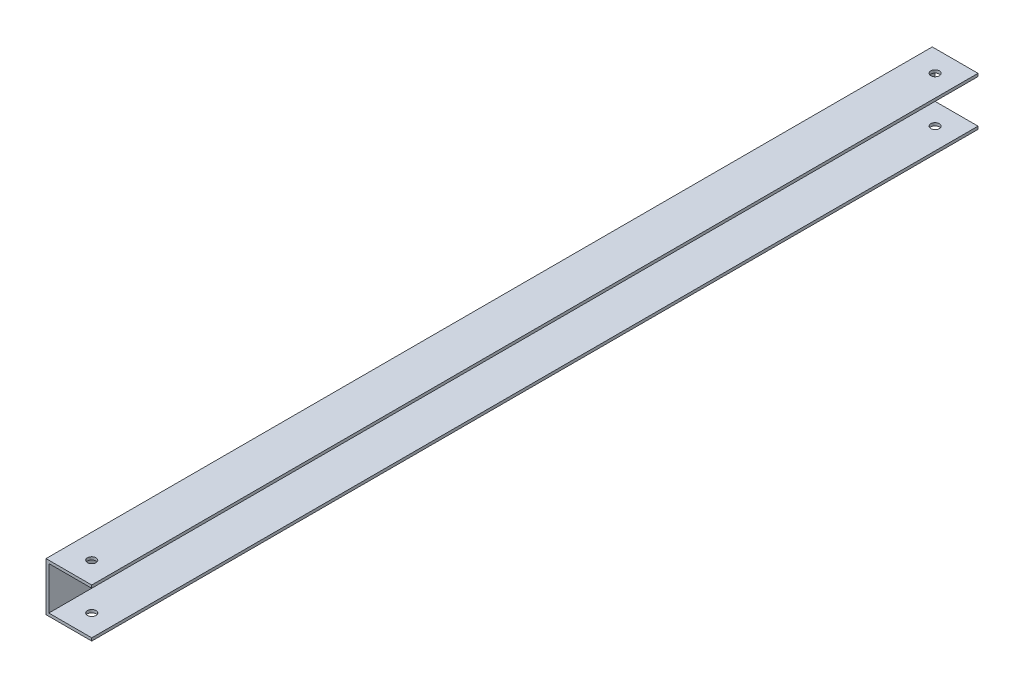
ISO-10303-21;
HEADER;
FILE_DESCRIPTION(('STEP AP214'),'2;1');
FILE_NAME('part.step','',(''),(''),'','','');
FILE_SCHEMA(('AUTOMOTIVE_DESIGN { 1 0 10303 214 1 1 1 1 }'));
ENDSEC;
DATA;
#1=APPLICATION_CONTEXT('core data for automotive mechanical design processes');
#2=APPLICATION_PROTOCOL_DEFINITION('international standard','automotive_design',2000,#1);
#3=PRODUCT_CONTEXT('',#1,'mechanical');
#4=PRODUCT('Part','Part','',(#3));
#5=PRODUCT_RELATED_PRODUCT_CATEGORY('part','',(#4));
#6=PRODUCT_DEFINITION_FORMATION('','',#4);
#7=PRODUCT_DEFINITION_CONTEXT('part definition',#1,'design');
#8=PRODUCT_DEFINITION('design','',#6,#7);
#9=PRODUCT_DEFINITION_SHAPE('','',#8);
#10=(LENGTH_UNIT() NAMED_UNIT(*) SI_UNIT(.MILLI.,.METRE.));
#11=(NAMED_UNIT(*) PLANE_ANGLE_UNIT() SI_UNIT($,.RADIAN.));
#12=(NAMED_UNIT(*) SI_UNIT($,.STERADIAN.) SOLID_ANGLE_UNIT());
#13=UNCERTAINTY_MEASURE_WITH_UNIT(LENGTH_MEASURE(1.E-05),#10,'distance_accuracy_value','');
#14=(GEOMETRIC_REPRESENTATION_CONTEXT(3) GLOBAL_UNCERTAINTY_ASSIGNED_CONTEXT((#13)) GLOBAL_UNIT_ASSIGNED_CONTEXT((#10,
#11,#12)) REPRESENTATION_CONTEXT('',''));
#15=CARTESIAN_POINT('',(0.,0.,0.));
#16=DIRECTION('',(0.,0.,1.));
#17=DIRECTION('',(1.,0.,0.));
#18=AXIS2_PLACEMENT_3D('',#15,#16,#17);
#19=CARTESIAN_POINT('',(-15.,15.,620.));
#20=DIRECTION('',(0.,1.,0.));
#21=DIRECTION('',(0.,0.,1.));
#22=AXIS2_PLACEMENT_3D('',#19,#20,#21);
#23=PLANE('',#22);
#24=CARTESIAN_POINT('',(0.,15.,15.));
#25=DIRECTION('',(0.,1.,0.));
#26=DIRECTION('',(0.,0.,1.));
#27=AXIS2_PLACEMENT_3D('',#24,#25,#26);
#28=CIRCLE('',#27,3.);
#29=CARTESIAN_POINT('',(0.,15.,18.));
#30=VERTEX_POINT('',#29);
#31=EDGE_CURVE('E170',#30,#30,#28,.T.);
#32=ORIENTED_EDGE('',*,*,#31,.T.);
#33=EDGE_LOOP('',(#32));
#34=FACE_BOUND('',#33,.T.);
#35=CARTESIAN_POINT('',(0.,15.,605.));
#36=DIRECTION('',(0.,1.,0.));
#37=DIRECTION('',(0.,0.,1.));
#38=AXIS2_PLACEMENT_3D('',#35,#36,#37);
#39=CIRCLE('',#38,3.);
#40=CARTESIAN_POINT('',(0.,15.,608.));
#41=VERTEX_POINT('',#40);
#42=EDGE_CURVE('E135',#41,#41,#39,.T.);
#43=ORIENTED_EDGE('',*,*,#42,.T.);
#44=EDGE_LOOP('',(#43));
#45=FACE_BOUND('',#44,.T.);
#46=DIRECTION('',(1.,0.,0.));
#47=VECTOR('',#46,1.);
#48=CARTESIAN_POINT('',(-15.,15.,0.));
#49=LINE('',#48,#47);
#50=CARTESIAN_POINT('',(-15.,15.,0.));
#51=VERTEX_POINT('',#50);
#52=CARTESIAN_POINT('',(15.,15.,0.));
#53=VERTEX_POINT('',#52);
#54=EDGE_CURVE('E131',#51,#53,#49,.T.);
#55=ORIENTED_EDGE('',*,*,#54,.T.);
#56=DIRECTION('',(0.,0.,-1.));
#57=VECTOR('',#56,1.);
#58=CARTESIAN_POINT('',(15.,15.,620.));
#59=LINE('',#58,#57);
#60=CARTESIAN_POINT('',(15.,15.,620.));
#61=VERTEX_POINT('',#60);
#62=EDGE_CURVE('E11',#61,#53,#59,.T.);
#63=ORIENTED_EDGE('',*,*,#62,.F.);
#64=DIRECTION('',(1.,0.,0.));
#65=VECTOR('',#64,1.);
#66=CARTESIAN_POINT('',(-15.,15.,620.));
#67=LINE('',#66,#65);
#68=CARTESIAN_POINT('',(-15.,15.,620.));
#69=VERTEX_POINT('',#68);
#70=EDGE_CURVE('E146',#69,#61,#67,.T.);
#71=ORIENTED_EDGE('',*,*,#70,.F.);
#72=DIRECTION('',(0.,0.,-1.));
#73=VECTOR('',#72,1.);
#74=CARTESIAN_POINT('',(-15.,15.,620.));
#75=LINE('',#74,#73);
#76=EDGE_CURVE('E127',#69,#51,#75,.T.);
#77=ORIENTED_EDGE('',*,*,#76,.T.);
#78=EDGE_LOOP('',(#55,#63,#71,#77));
#79=FACE_BOUND('',#78,.T.);
#80=ADVANCED_FACE('F33',(#34,#45,#79),#23,.F.);
#81=CARTESIAN_POINT('',(15.,15.,620.));
#82=DIRECTION('',(-1.,0.,0.));
#83=DIRECTION('',(0.,0.,1.));
#84=AXIS2_PLACEMENT_3D('',#81,#82,#83);
#85=PLANE('',#84);
#86=DIRECTION('',(0.,1.,0.));
#87=VECTOR('',#86,1.);
#88=CARTESIAN_POINT('',(15.,15.,0.));
#89=LINE('',#88,#87);
#90=CARTESIAN_POINT('',(15.,17.,0.));
#91=VERTEX_POINT('',#90);
#92=EDGE_CURVE('E134',#53,#91,#89,.T.);
#93=ORIENTED_EDGE('',*,*,#92,.T.);
#94=DIRECTION('',(0.,0.,-1.));
#95=VECTOR('',#94,1.);
#96=CARTESIAN_POINT('',(15.,17.,620.));
#97=LINE('',#96,#95);
#98=CARTESIAN_POINT('',(15.,17.,620.));
#99=VERTEX_POINT('',#98);
#100=EDGE_CURVE('E42',#99,#91,#97,.T.);
#101=ORIENTED_EDGE('',*,*,#100,.F.);
#102=DIRECTION('',(0.,1.,0.));
#103=VECTOR('',#102,1.);
#104=CARTESIAN_POINT('',(15.,15.,620.));
#105=LINE('',#104,#103);
#106=EDGE_CURVE('E94',#61,#99,#105,.T.);
#107=ORIENTED_EDGE('',*,*,#106,.F.);
#108=ORIENTED_EDGE('',*,*,#62,.T.);
#109=EDGE_LOOP('',(#93,#101,#107,#108));
#110=FACE_BOUND('',#109,.T.);
#111=ADVANCED_FACE('F209',(#110),#85,.F.);
#112=CARTESIAN_POINT('',(-17.,17.,620.));
#113=DIRECTION('',(0.,-1.,0.));
#114=DIRECTION('',(0.,0.,-1.));
#115=AXIS2_PLACEMENT_3D('',#112,#113,#114);
#116=PLANE('',#115);
#117=CARTESIAN_POINT('',(0.,17.,15.));
#118=DIRECTION('',(0.,1.,0.));
#119=DIRECTION('',(0.,0.,1.));
#120=AXIS2_PLACEMENT_3D('',#117,#118,#119);
#121=CIRCLE('',#120,3.);
#122=CARTESIAN_POINT('',(0.,17.,18.));
#123=VERTEX_POINT('',#122);
#124=EDGE_CURVE('E272',#123,#123,#121,.T.);
#125=ORIENTED_EDGE('',*,*,#124,.F.);
#126=EDGE_LOOP('',(#125));
#127=FACE_BOUND('',#126,.T.);
#128=CARTESIAN_POINT('',(0.,17.,605.));
#129=DIRECTION('',(0.,1.,0.));
#130=DIRECTION('',(0.,0.,1.));
#131=AXIS2_PLACEMENT_3D('',#128,#129,#130);
#132=CIRCLE('',#131,3.);
#133=CARTESIAN_POINT('',(0.,17.,608.));
#134=VERTEX_POINT('',#133);
#135=EDGE_CURVE('E165',#134,#134,#132,.T.);
#136=ORIENTED_EDGE('',*,*,#135,.F.);
#137=EDGE_LOOP('',(#136));
#138=FACE_BOUND('',#137,.T.);
#139=DIRECTION('',(-1.,0.,0.));
#140=VECTOR('',#139,1.);
#141=CARTESIAN_POINT('',(-17.,17.,0.));
#142=LINE('',#141,#140);
#143=CARTESIAN_POINT('',(-17.,17.,0.));
#144=VERTEX_POINT('',#143);
#145=EDGE_CURVE('E137',#91,#144,#142,.T.);
#146=ORIENTED_EDGE('',*,*,#145,.T.);
#147=DIRECTION('',(0.,0.,-1.));
#148=VECTOR('',#147,1.);
#149=CARTESIAN_POINT('',(-17.,17.,620.));
#150=LINE('',#149,#148);
#151=CARTESIAN_POINT('',(-17.,17.,620.));
#152=VERTEX_POINT('',#151);
#153=EDGE_CURVE('E153',#152,#144,#150,.T.);
#154=ORIENTED_EDGE('',*,*,#153,.F.);
#155=DIRECTION('',(-1.,0.,0.));
#156=VECTOR('',#155,1.);
#157=CARTESIAN_POINT('',(-17.,17.,620.));
#158=LINE('',#157,#156);
#159=EDGE_CURVE('E177',#99,#152,#158,.T.);
#160=ORIENTED_EDGE('',*,*,#159,.F.);
#161=ORIENTED_EDGE('',*,*,#100,.T.);
#162=EDGE_LOOP('',(#146,#154,#160,#161));
#163=FACE_BOUND('',#162,.T.);
#164=ADVANCED_FACE('F214',(#127,#138,#163),#116,.F.);
#165=CARTESIAN_POINT('',(-17.,-17.,620.));
#166=DIRECTION('',(1.,0.,0.));
#167=DIRECTION('',(0.,0.,-1.));
#168=AXIS2_PLACEMENT_3D('',#165,#166,#167);
#169=PLANE('',#168);
#170=DIRECTION('',(0.,-1.,0.));
#171=VECTOR('',#170,1.);
#172=CARTESIAN_POINT('',(-17.,-17.,0.));
#173=LINE('',#172,#171);
#174=CARTESIAN_POINT('',(-17.,-17.,0.));
#175=VERTEX_POINT('',#174);
#176=EDGE_CURVE('E139',#144,#175,#173,.T.);
#177=ORIENTED_EDGE('',*,*,#176,.T.);
#178=DIRECTION('',(0.,0.,-1.));
#179=VECTOR('',#178,1.);
#180=CARTESIAN_POINT('',(-17.,-17.,620.));
#181=LINE('',#180,#179);
#182=CARTESIAN_POINT('',(-17.,-17.,620.));
#183=VERTEX_POINT('',#182);
#184=EDGE_CURVE('E150',#183,#175,#181,.T.);
#185=ORIENTED_EDGE('',*,*,#184,.F.);
#186=DIRECTION('',(0.,-1.,0.));
#187=VECTOR('',#186,1.);
#188=CARTESIAN_POINT('',(-17.,-17.,620.));
#189=LINE('',#188,#187);
#190=EDGE_CURVE('E179',#152,#183,#189,.T.);
#191=ORIENTED_EDGE('',*,*,#190,.F.);
#192=ORIENTED_EDGE('',*,*,#153,.T.);
#193=EDGE_LOOP('',(#177,#185,#191,#192));
#194=FACE_BOUND('',#193,.T.);
#195=ADVANCED_FACE('F185',(#194),#169,.F.);
#196=CARTESIAN_POINT('',(-17.,-17.,620.));
#197=DIRECTION('',(0.,1.,0.));
#198=DIRECTION('',(0.,0.,1.));
#199=AXIS2_PLACEMENT_3D('',#196,#197,#198);
#200=PLANE('',#199);
#201=CARTESIAN_POINT('',(0.,-17.,15.));
#202=DIRECTION('',(0.,1.,0.));
#203=DIRECTION('',(0.,0.,1.));
#204=AXIS2_PLACEMENT_3D('',#201,#202,#203);
#205=CIRCLE('',#204,3.);
#206=CARTESIAN_POINT('',(0.,-17.,18.));
#207=VERTEX_POINT('',#206);
#208=EDGE_CURVE('E274',#207,#207,#205,.T.);
#209=ORIENTED_EDGE('',*,*,#208,.T.);
#210=EDGE_LOOP('',(#209));
#211=FACE_BOUND('',#210,.T.);
#212=CARTESIAN_POINT('',(0.,-17.,605.));
#213=DIRECTION('',(0.,1.,0.));
#214=DIRECTION('',(0.,0.,1.));
#215=AXIS2_PLACEMENT_3D('',#212,#213,#214);
#216=CIRCLE('',#215,3.);
#217=CARTESIAN_POINT('',(0.,-17.,608.));
#218=VERTEX_POINT('',#217);
#219=EDGE_CURVE('E159',#218,#218,#216,.T.);
#220=ORIENTED_EDGE('',*,*,#219,.T.);
#221=EDGE_LOOP('',(#220));
#222=FACE_BOUND('',#221,.T.);
#223=DIRECTION('',(1.,0.,0.));
#224=VECTOR('',#223,1.);
#225=CARTESIAN_POINT('',(-17.,-17.,0.));
#226=LINE('',#225,#224);
#227=CARTESIAN_POINT('',(15.,-17.,0.));
#228=VERTEX_POINT('',#227);
#229=EDGE_CURVE('E141',#175,#228,#226,.T.);
#230=ORIENTED_EDGE('',*,*,#229,.T.);
#231=DIRECTION('',(0.,0.,-1.));
#232=VECTOR('',#231,1.);
#233=CARTESIAN_POINT('',(15.,-17.,620.));
#234=LINE('',#233,#232);
#235=CARTESIAN_POINT('',(15.,-17.,620.));
#236=VERTEX_POINT('',#235);
#237=EDGE_CURVE('E122',#236,#228,#234,.T.);
#238=ORIENTED_EDGE('',*,*,#237,.F.);
#239=DIRECTION('',(1.,0.,0.));
#240=VECTOR('',#239,1.);
#241=CARTESIAN_POINT('',(-17.,-17.,620.));
#242=LINE('',#241,#240);
#243=EDGE_CURVE('E113',#183,#236,#242,.T.);
#244=ORIENTED_EDGE('',*,*,#243,.F.);
#245=ORIENTED_EDGE('',*,*,#184,.T.);
#246=EDGE_LOOP('',(#230,#238,#244,#245));
#247=FACE_BOUND('',#246,.T.);
#248=ADVANCED_FACE('F189',(#211,#222,#247),#200,.F.);
#249=CARTESIAN_POINT('',(15.,-15.,620.));
#250=DIRECTION('',(-1.,0.,0.));
#251=DIRECTION('',(0.,0.,1.));
#252=AXIS2_PLACEMENT_3D('',#249,#250,#251);
#253=PLANE('',#252);
#254=DIRECTION('',(0.,1.,0.));
#255=VECTOR('',#254,1.);
#256=CARTESIAN_POINT('',(15.,-15.,0.));
#257=LINE('',#256,#255);
#258=CARTESIAN_POINT('',(15.,-15.,0.));
#259=VERTEX_POINT('',#258);
#260=EDGE_CURVE('E121',#228,#259,#257,.T.);
#261=ORIENTED_EDGE('',*,*,#260,.T.);
#262=DIRECTION('',(0.,0.,-1.));
#263=VECTOR('',#262,1.);
#264=CARTESIAN_POINT('',(15.,-15.,620.));
#265=LINE('',#264,#263);
#266=CARTESIAN_POINT('',(15.,-15.,620.));
#267=VERTEX_POINT('',#266);
#268=EDGE_CURVE('E118',#267,#259,#265,.T.);
#269=ORIENTED_EDGE('',*,*,#268,.F.);
#270=DIRECTION('',(0.,1.,0.));
#271=VECTOR('',#270,1.);
#272=CARTESIAN_POINT('',(15.,-15.,620.));
#273=LINE('',#272,#271);
#274=EDGE_CURVE('E107',#236,#267,#273,.T.);
#275=ORIENTED_EDGE('',*,*,#274,.F.);
#276=ORIENTED_EDGE('',*,*,#237,.T.);
#277=EDGE_LOOP('',(#261,#269,#275,#276));
#278=FACE_BOUND('',#277,.T.);
#279=ADVANCED_FACE('F119',(#278),#253,.F.);
#280=CARTESIAN_POINT('',(-15.,-15.,620.));
#281=DIRECTION('',(0.,-1.,0.));
#282=DIRECTION('',(0.,0.,-1.));
#283=AXIS2_PLACEMENT_3D('',#280,#281,#282);
#284=PLANE('',#283);
#285=CARTESIAN_POINT('',(0.,-15.,15.));
#286=DIRECTION('',(0.,-1.,0.));
#287=DIRECTION('',(0.,0.,-1.));
#288=AXIS2_PLACEMENT_3D('',#285,#286,#287);
#289=CIRCLE('',#288,3.);
#290=CARTESIAN_POINT('',(0.,-15.,12.));
#291=VERTEX_POINT('',#290);
#292=EDGE_CURVE('E36',#291,#291,#289,.T.);
#293=ORIENTED_EDGE('',*,*,#292,.T.);
#294=EDGE_LOOP('',(#293));
#295=FACE_BOUND('',#294,.T.);
#296=CARTESIAN_POINT('',(0.,-15.,605.));
#297=DIRECTION('',(0.,-1.,0.));
#298=DIRECTION('',(0.,0.,-1.));
#299=AXIS2_PLACEMENT_3D('',#296,#297,#298);
#300=CIRCLE('',#299,3.);
#301=CARTESIAN_POINT('',(0.,-15.,602.));
#302=VERTEX_POINT('',#301);
#303=EDGE_CURVE('E157',#302,#302,#300,.T.);
#304=ORIENTED_EDGE('',*,*,#303,.T.);
#305=EDGE_LOOP('',(#304));
#306=FACE_BOUND('',#305,.T.);
#307=DIRECTION('',(-1.,0.,0.));
#308=VECTOR('',#307,1.);
#309=CARTESIAN_POINT('',(-15.,-15.,0.));
#310=LINE('',#309,#308);
#311=CARTESIAN_POINT('',(-15.,-15.,0.));
#312=VERTEX_POINT('',#311);
#313=EDGE_CURVE('E80',#259,#312,#310,.T.);
#314=ORIENTED_EDGE('',*,*,#313,.T.);
#315=DIRECTION('',(0.,0.,-1.));
#316=VECTOR('',#315,1.);
#317=CARTESIAN_POINT('',(-15.,-15.,620.));
#318=LINE('',#317,#316);
#319=CARTESIAN_POINT('',(-15.,-15.,620.));
#320=VERTEX_POINT('',#319);
#321=EDGE_CURVE('E123',#320,#312,#318,.T.);
#322=ORIENTED_EDGE('',*,*,#321,.F.);
#323=DIRECTION('',(-1.,0.,0.));
#324=VECTOR('',#323,1.);
#325=CARTESIAN_POINT('',(-15.,-15.,620.));
#326=LINE('',#325,#324);
#327=EDGE_CURVE('E111',#267,#320,#326,.T.);
#328=ORIENTED_EDGE('',*,*,#327,.F.);
#329=ORIENTED_EDGE('',*,*,#268,.T.);
#330=EDGE_LOOP('',(#314,#322,#328,#329));
#331=FACE_BOUND('',#330,.T.);
#332=ADVANCED_FACE('F125',(#295,#306,#331),#284,.F.);
#333=CARTESIAN_POINT('',(-15.,-15.,620.));
#334=DIRECTION('',(-1.,0.,0.));
#335=DIRECTION('',(0.,0.,1.));
#336=AXIS2_PLACEMENT_3D('',#333,#334,#335);
#337=PLANE('',#336);
#338=DIRECTION('',(0.,1.,0.));
#339=VECTOR('',#338,1.);
#340=CARTESIAN_POINT('',(-15.,-15.,0.));
#341=LINE('',#340,#339);
#342=EDGE_CURVE('E86',#312,#51,#341,.T.);
#343=ORIENTED_EDGE('',*,*,#342,.T.);
#344=ORIENTED_EDGE('',*,*,#76,.F.);
#345=DIRECTION('',(0.,1.,0.));
#346=VECTOR('',#345,1.);
#347=CARTESIAN_POINT('',(-15.,-15.,620.));
#348=LINE('',#347,#346);
#349=EDGE_CURVE('E51',#320,#69,#348,.T.);
#350=ORIENTED_EDGE('',*,*,#349,.F.);
#351=ORIENTED_EDGE('',*,*,#321,.T.);
#352=EDGE_LOOP('',(#343,#344,#350,#351));
#353=FACE_BOUND('',#352,.T.);
#354=ADVANCED_FACE('F197',(#353),#337,.F.);
#355=CARTESIAN_POINT('',(0.,0.,620.));
#356=DIRECTION('',(0.,0.,1.));
#357=DIRECTION('',(1.,0.,0.));
#358=AXIS2_PLACEMENT_3D('',#355,#356,#357);
#359=PLANE('',#358);
#360=ORIENTED_EDGE('',*,*,#70,.T.);
#361=ORIENTED_EDGE('',*,*,#106,.T.);
#362=ORIENTED_EDGE('',*,*,#159,.T.);
#363=ORIENTED_EDGE('',*,*,#190,.T.);
#364=ORIENTED_EDGE('',*,*,#243,.T.);
#365=ORIENTED_EDGE('',*,*,#274,.T.);
#366=ORIENTED_EDGE('',*,*,#327,.T.);
#367=ORIENTED_EDGE('',*,*,#349,.T.);
#368=EDGE_LOOP('',(#360,#361,#362,#363,#364,#365,#366,#367));
#369=FACE_BOUND('',#368,.T.);
#370=ADVANCED_FACE('F109',(#369),#359,.T.);
#371=CARTESIAN_POINT('',(0.,0.,0.));
#372=DIRECTION('',(0.,0.,1.));
#373=DIRECTION('',(1.,0.,0.));
#374=AXIS2_PLACEMENT_3D('',#371,#372,#373);
#375=PLANE('',#374);
#376=ORIENTED_EDGE('',*,*,#54,.F.);
#377=ORIENTED_EDGE('',*,*,#342,.F.);
#378=ORIENTED_EDGE('',*,*,#313,.F.);
#379=ORIENTED_EDGE('',*,*,#260,.F.);
#380=ORIENTED_EDGE('',*,*,#229,.F.);
#381=ORIENTED_EDGE('',*,*,#176,.F.);
#382=ORIENTED_EDGE('',*,*,#145,.F.);
#383=ORIENTED_EDGE('',*,*,#92,.F.);
#384=EDGE_LOOP('',(#376,#377,#378,#379,#380,#381,#382,#383));
#385=FACE_BOUND('',#384,.T.);
#386=ADVANCED_FACE('F192',(#385),#375,.F.);
#387=CARTESIAN_POINT('',(0.,-17.,605.));
#388=DIRECTION('',(0.,1.,0.));
#389=DIRECTION('',(0.,0.,1.));
#390=AXIS2_PLACEMENT_3D('',#387,#388,#389);
#391=CYLINDRICAL_SURFACE('',#390,3.);
#392=ORIENTED_EDGE('',*,*,#219,.F.);
#393=EDGE_LOOP('',(#392));
#394=FACE_BOUND('',#393,.T.);
#395=ORIENTED_EDGE('',*,*,#303,.F.);
#396=EDGE_LOOP('',(#395));
#397=FACE_BOUND('',#396,.T.);
#398=ADVANCED_FACE('F223',(#394,#397),#391,.F.);
#399=ORIENTED_EDGE('',*,*,#135,.T.);
#400=EDGE_LOOP('',(#399));
#401=FACE_BOUND('',#400,.T.);
#402=ORIENTED_EDGE('',*,*,#42,.F.);
#403=EDGE_LOOP('',(#402));
#404=FACE_BOUND('',#403,.T.);
#405=ADVANCED_FACE('F220',(#401,#404),#391,.F.);
#406=CARTESIAN_POINT('',(0.,-17.,15.));
#407=DIRECTION('',(0.,1.,0.));
#408=DIRECTION('',(0.,0.,1.));
#409=AXIS2_PLACEMENT_3D('',#406,#407,#408);
#410=CYLINDRICAL_SURFACE('',#409,3.);
#411=ORIENTED_EDGE('',*,*,#208,.F.);
#412=EDGE_LOOP('',(#411));
#413=FACE_BOUND('',#412,.T.);
#414=ORIENTED_EDGE('',*,*,#292,.F.);
#415=EDGE_LOOP('',(#414));
#416=FACE_BOUND('',#415,.T.);
#417=ADVANCED_FACE('F222',(#413,#416),#410,.F.);
#418=ORIENTED_EDGE('',*,*,#124,.T.);
#419=EDGE_LOOP('',(#418));
#420=FACE_BOUND('',#419,.T.);
#421=ORIENTED_EDGE('',*,*,#31,.F.);
#422=EDGE_LOOP('',(#421));
#423=FACE_BOUND('',#422,.T.);
#424=ADVANCED_FACE('F230',(#420,#423),#410,.F.);
#425=CLOSED_SHELL('',(#80,#111,#164,#195,#248,#279,#332,#354,#370,#386,#398,#405,#417,#424));
#426=MANIFOLD_SOLID_BREP('B2',#425);
#427=ADVANCED_BREP_SHAPE_REPRESENTATION('',(#18,#426),#14);
#428=SHAPE_DEFINITION_REPRESENTATION(#9,#427);
ENDSEC;
END-ISO-10303-21;
